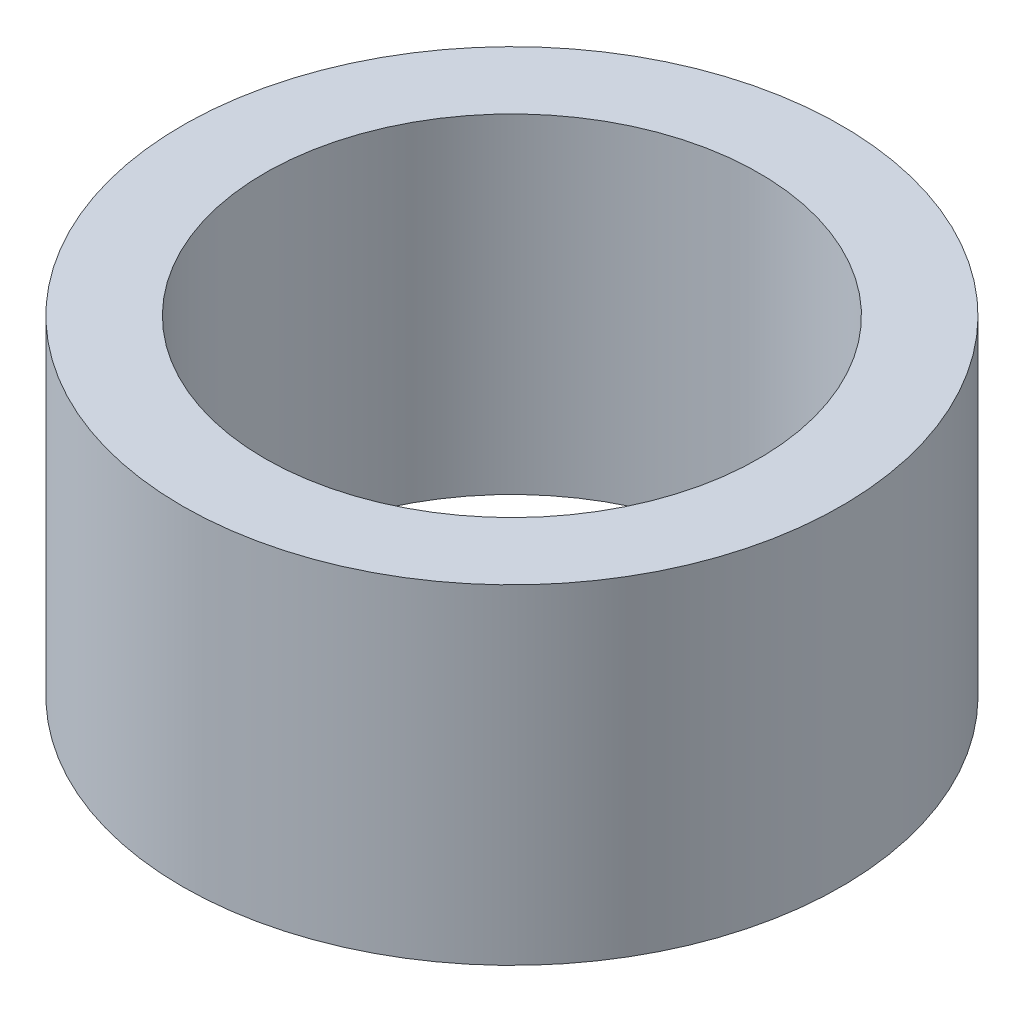
ISO-10303-21;
HEADER;
FILE_DESCRIPTION(('STEP AP214'),'2;1');
FILE_NAME('part.step','',(''),(''),'','','');
FILE_SCHEMA(('AUTOMOTIVE_DESIGN { 1 0 10303 214 1 1 1 1 }'));
ENDSEC;
DATA;
#1=APPLICATION_CONTEXT('core data for automotive mechanical design processes');
#2=APPLICATION_PROTOCOL_DEFINITION('international standard','automotive_design',2000,#1);
#3=PRODUCT_CONTEXT('',#1,'mechanical');
#4=PRODUCT('Part','Part','',(#3));
#5=PRODUCT_RELATED_PRODUCT_CATEGORY('part','',(#4));
#6=PRODUCT_DEFINITION_FORMATION('','',#4);
#7=PRODUCT_DEFINITION_CONTEXT('part definition',#1,'design');
#8=PRODUCT_DEFINITION('design','',#6,#7);
#9=PRODUCT_DEFINITION_SHAPE('','',#8);
#10=(LENGTH_UNIT() NAMED_UNIT(*) SI_UNIT(.MILLI.,.METRE.));
#11=(NAMED_UNIT(*) PLANE_ANGLE_UNIT() SI_UNIT($,.RADIAN.));
#12=(NAMED_UNIT(*) SI_UNIT($,.STERADIAN.) SOLID_ANGLE_UNIT());
#13=UNCERTAINTY_MEASURE_WITH_UNIT(LENGTH_MEASURE(1.E-05),#10,'distance_accuracy_value','');
#14=(GEOMETRIC_REPRESENTATION_CONTEXT(3) GLOBAL_UNCERTAINTY_ASSIGNED_CONTEXT((#13)) GLOBAL_UNIT_ASSIGNED_CONTEXT((#10,
#11,#12)) REPRESENTATION_CONTEXT('',''));
#15=CARTESIAN_POINT('',(0.,0.,0.));
#16=DIRECTION('',(0.,0.,1.));
#17=DIRECTION('',(1.,0.,0.));
#18=AXIS2_PLACEMENT_3D('',#15,#16,#17);
#19=CARTESIAN_POINT('',(0.,4.,0.));
#20=DIRECTION('',(0.,1.,0.));
#21=DIRECTION('',(0.,0.,1.));
#22=AXIS2_PLACEMENT_3D('',#19,#20,#21);
#23=PLANE('',#22);
#24=CARTESIAN_POINT('',(0.,4.,0.));
#25=DIRECTION('',(0.,1.,0.));
#26=DIRECTION('',(0.,0.,1.));
#27=AXIS2_PLACEMENT_3D('',#24,#25,#26);
#28=CIRCLE('',#27,4.);
#29=CARTESIAN_POINT('',(0.,4.,4.));
#30=VERTEX_POINT('',#29);
#31=EDGE_CURVE('E10',#30,#30,#28,.T.);
#32=ORIENTED_EDGE('',*,*,#31,.T.);
#33=EDGE_LOOP('',(#32));
#34=FACE_BOUND('',#33,.T.);
#35=CARTESIAN_POINT('',(0.,4.,0.));
#36=DIRECTION('',(0.,1.,0.));
#37=DIRECTION('',(0.,0.,1.));
#38=AXIS2_PLACEMENT_3D('',#35,#36,#37);
#39=CIRCLE('',#38,3.);
#40=CARTESIAN_POINT('',(0.,4.,3.));
#41=VERTEX_POINT('',#40);
#42=EDGE_CURVE('E42',#41,#41,#39,.T.);
#43=ORIENTED_EDGE('',*,*,#42,.F.);
#44=EDGE_LOOP('',(#43));
#45=FACE_BOUND('',#44,.T.);
#46=ADVANCED_FACE('F31',(#34,#45),#23,.T.);
#47=CARTESIAN_POINT('',(0.,0.,0.));
#48=DIRECTION('',(0.,1.,0.));
#49=DIRECTION('',(0.,0.,1.));
#50=AXIS2_PLACEMENT_3D('',#47,#48,#49);
#51=PLANE('',#50);
#52=CARTESIAN_POINT('',(0.,0.,0.));
#53=DIRECTION('',(0.,1.,0.));
#54=DIRECTION('',(0.,0.,1.));
#55=AXIS2_PLACEMENT_3D('',#52,#53,#54);
#56=CIRCLE('',#55,4.);
#57=CARTESIAN_POINT('',(0.,0.,4.));
#58=VERTEX_POINT('',#57);
#59=EDGE_CURVE('E35',#58,#58,#56,.T.);
#60=ORIENTED_EDGE('',*,*,#59,.F.);
#61=EDGE_LOOP('',(#60));
#62=FACE_BOUND('',#61,.T.);
#63=CARTESIAN_POINT('',(0.,0.,0.));
#64=DIRECTION('',(0.,1.,0.));
#65=DIRECTION('',(0.,0.,1.));
#66=AXIS2_PLACEMENT_3D('',#63,#64,#65);
#67=CIRCLE('',#66,3.);
#68=CARTESIAN_POINT('',(0.,0.,3.));
#69=VERTEX_POINT('',#68);
#70=EDGE_CURVE('E44',#69,#69,#67,.T.);
#71=ORIENTED_EDGE('',*,*,#70,.T.);
#72=EDGE_LOOP('',(#71));
#73=FACE_BOUND('',#72,.T.);
#74=ADVANCED_FACE('F54',(#62,#73),#51,.F.);
#75=CARTESIAN_POINT('',(0.,4.,0.));
#76=DIRECTION('',(0.,-1.,0.));
#77=DIRECTION('',(0.,0.,-1.));
#78=AXIS2_PLACEMENT_3D('',#75,#76,#77);
#79=CYLINDRICAL_SURFACE('',#78,4.);
#80=ORIENTED_EDGE('',*,*,#31,.F.);
#81=EDGE_LOOP('',(#80));
#82=FACE_BOUND('',#81,.T.);
#83=ORIENTED_EDGE('',*,*,#59,.T.);
#84=EDGE_LOOP('',(#83));
#85=FACE_BOUND('',#84,.T.);
#86=ADVANCED_FACE('F33',(#82,#85),#79,.T.);
#87=CARTESIAN_POINT('',(0.,4.,0.));
#88=DIRECTION('',(0.,-1.,0.));
#89=DIRECTION('',(0.,0.,-1.));
#90=AXIS2_PLACEMENT_3D('',#87,#88,#89);
#91=CYLINDRICAL_SURFACE('',#90,3.);
#92=ORIENTED_EDGE('',*,*,#42,.T.);
#93=EDGE_LOOP('',(#92));
#94=FACE_BOUND('',#93,.T.);
#95=ORIENTED_EDGE('',*,*,#70,.F.);
#96=EDGE_LOOP('',(#95));
#97=FACE_BOUND('',#96,.T.);
#98=ADVANCED_FACE('F50',(#94,#97),#91,.F.);
#99=CLOSED_SHELL('',(#46,#74,#86,#98));
#100=MANIFOLD_SOLID_BREP('B2',#99);
#101=ADVANCED_BREP_SHAPE_REPRESENTATION('',(#18,#100),#14);
#102=SHAPE_DEFINITION_REPRESENTATION(#9,#101);
ENDSEC;
END-ISO-10303-21;
